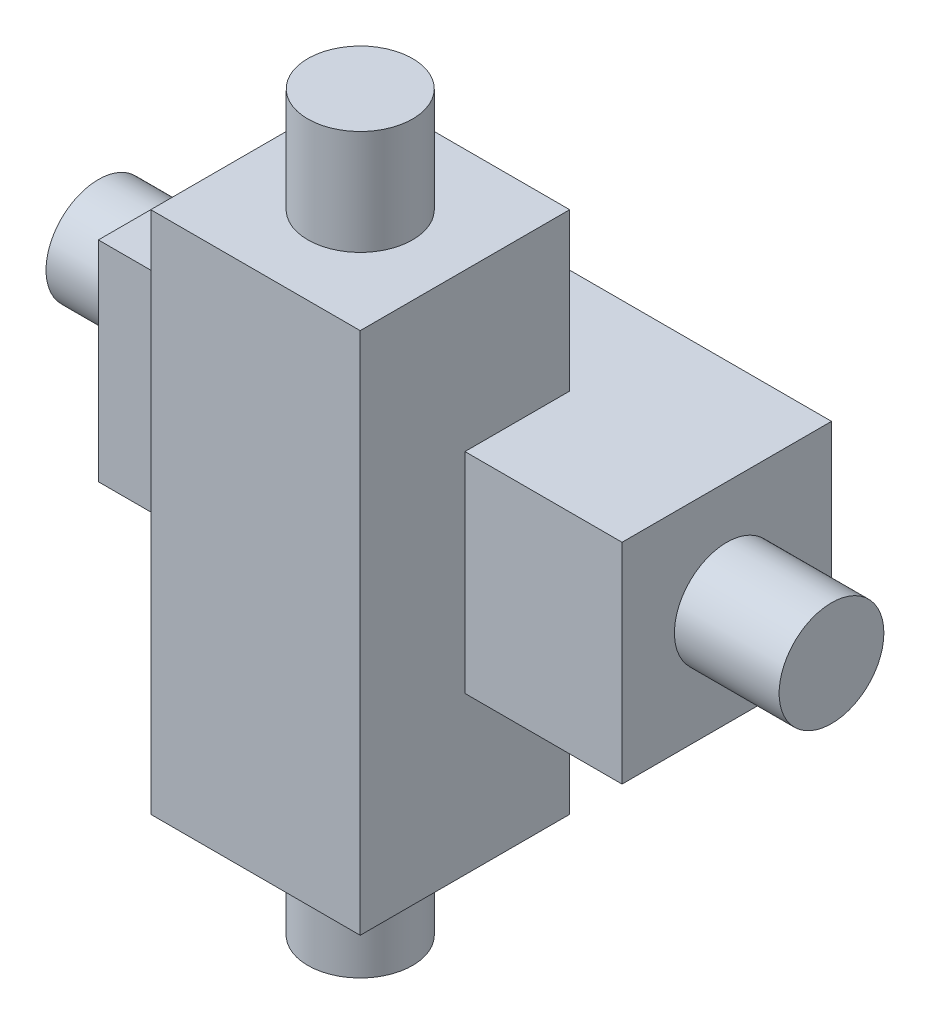
ISO-10303-21;
HEADER;
FILE_DESCRIPTION(('STEP AP214'),'2;1');
FILE_NAME('part.step','',(''),(''),'','','');
FILE_SCHEMA(('AUTOMOTIVE_DESIGN { 1 0 10303 214 1 1 1 1 }'));
ENDSEC;
DATA;
#1=APPLICATION_CONTEXT('core data for automotive mechanical design processes');
#2=APPLICATION_PROTOCOL_DEFINITION('international standard','automotive_design',2000,#1);
#3=PRODUCT_CONTEXT('',#1,'mechanical');
#4=PRODUCT('Part','Part','',(#3));
#5=PRODUCT_RELATED_PRODUCT_CATEGORY('part','',(#4));
#6=PRODUCT_DEFINITION_FORMATION('','',#4);
#7=PRODUCT_DEFINITION_CONTEXT('part definition',#1,'design');
#8=PRODUCT_DEFINITION('design','',#6,#7);
#9=PRODUCT_DEFINITION_SHAPE('','',#8);
#10=(LENGTH_UNIT() NAMED_UNIT(*) SI_UNIT(.MILLI.,.METRE.));
#11=(NAMED_UNIT(*) PLANE_ANGLE_UNIT() SI_UNIT($,.RADIAN.));
#12=(NAMED_UNIT(*) SI_UNIT($,.STERADIAN.) SOLID_ANGLE_UNIT());
#13=UNCERTAINTY_MEASURE_WITH_UNIT(LENGTH_MEASURE(1.E-05),#10,'distance_accuracy_value','');
#14=(GEOMETRIC_REPRESENTATION_CONTEXT(3) GLOBAL_UNCERTAINTY_ASSIGNED_CONTEXT((#13)) GLOBAL_UNIT_ASSIGNED_CONTEXT((#10,
#11,#12)) REPRESENTATION_CONTEXT('',''));
#15=CARTESIAN_POINT('',(0.,0.,0.));
#16=DIRECTION('',(0.,0.,1.));
#17=DIRECTION('',(1.,0.,0.));
#18=AXIS2_PLACEMENT_3D('',#15,#16,#17);
#19=CARTESIAN_POINT('',(1.,2.5,-0.999999999999996));
#20=DIRECTION('',(-1.,0.,0.));
#21=DIRECTION('',(0.,0.,1.));
#22=AXIS2_PLACEMENT_3D('',#19,#20,#21);
#23=PLANE('',#22);
#24=DIRECTION('',(0.,0.,1.));
#25=VECTOR('',#24,1.);
#26=CARTESIAN_POINT('',(1.,0.999999999999999,-0.999999999999996));
#27=LINE('',#26,#25);
#28=CARTESIAN_POINT('',(1.,0.999999999999999,-0.999999999999996));
#29=VERTEX_POINT('',#28);
#30=CARTESIAN_POINT('',(1.,0.999999999999999,0.));
#31=VERTEX_POINT('',#30);
#32=EDGE_CURVE('E174',#29,#31,#27,.T.);
#33=ORIENTED_EDGE('',*,*,#32,.F.);
#34=DIRECTION('',(0.,-1.,0.));
#35=VECTOR('',#34,1.);
#36=CARTESIAN_POINT('',(1.,2.5,-0.999999999999996));
#37=LINE('',#36,#35);
#38=CARTESIAN_POINT('',(1.,2.5,-0.999999999999996));
#39=VERTEX_POINT('',#38);
#40=EDGE_CURVE('E218',#39,#29,#37,.T.);
#41=ORIENTED_EDGE('',*,*,#40,.F.);
#42=DIRECTION('',(0.,0.,-1.));
#43=VECTOR('',#42,1.);
#44=CARTESIAN_POINT('',(1.,2.5,-0.999999999999996));
#45=LINE('',#44,#43);
#46=CARTESIAN_POINT('',(1.,2.5,1.));
#47=VERTEX_POINT('',#46);
#48=EDGE_CURVE('E178',#47,#39,#45,.T.);
#49=ORIENTED_EDGE('',*,*,#48,.F.);
#50=DIRECTION('',(0.,-1.,0.));
#51=VECTOR('',#50,1.);
#52=CARTESIAN_POINT('',(1.,2.5,1.));
#53=LINE('',#52,#51);
#54=CARTESIAN_POINT('',(1.,-2.5,1.));
#55=VERTEX_POINT('',#54);
#56=EDGE_CURVE('E192',#47,#55,#53,.T.);
#57=ORIENTED_EDGE('',*,*,#56,.T.);
#58=DIRECTION('',(0.,0.,-1.));
#59=VECTOR('',#58,1.);
#60=CARTESIAN_POINT('',(1.,-2.5,-0.999999999999996));
#61=LINE('',#60,#59);
#62=CARTESIAN_POINT('',(1.,-2.5,-0.999999999999996));
#63=VERTEX_POINT('',#62);
#64=EDGE_CURVE('E177',#55,#63,#61,.T.);
#65=ORIENTED_EDGE('',*,*,#64,.T.);
#66=CARTESIAN_POINT('',(1.,-0.999999999999999,-0.999999999999996));
#67=VERTEX_POINT('',#66);
#68=EDGE_CURVE('E217',#67,#63,#37,.T.);
#69=ORIENTED_EDGE('',*,*,#68,.F.);
#70=DIRECTION('',(0.,0.,-1.));
#71=VECTOR('',#70,1.);
#72=CARTESIAN_POINT('',(1.,-0.999999999999999,-0.999999999999996));
#73=LINE('',#72,#71);
#74=CARTESIAN_POINT('',(1.,-0.999999999999999,0.));
#75=VERTEX_POINT('',#74);
#76=EDGE_CURVE('E59',#75,#67,#73,.T.);
#77=ORIENTED_EDGE('',*,*,#76,.F.);
#78=DIRECTION('',(0.,-1.,0.));
#79=VECTOR('',#78,1.);
#80=CARTESIAN_POINT('',(1.,2.5,0.));
#81=LINE('',#80,#79);
#82=EDGE_CURVE('E54',#31,#75,#81,.T.);
#83=ORIENTED_EDGE('',*,*,#82,.F.);
#84=EDGE_LOOP('',(#33,#41,#49,#57,#65,#69,#77,#83));
#85=FACE_BOUND('',#84,.T.);
#86=ADVANCED_FACE('F39',(#85),#23,.F.);
#87=CARTESIAN_POINT('',(-0.999999999999996,2.5,-0.999999999999996));
#88=DIRECTION('',(0.,0.,1.));
#89=DIRECTION('',(1.,0.,0.));
#90=AXIS2_PLACEMENT_3D('',#87,#88,#89);
#91=PLANE('',#90);
#92=DIRECTION('',(1.,0.,0.));
#93=VECTOR('',#92,1.);
#94=CARTESIAN_POINT('',(-0.999999999999996,0.999999999999999,-0.999999999999996));
#95=LINE('',#94,#93);
#96=CARTESIAN_POINT('',(-0.999999999999996,0.999999999999999,-0.999999999999996));
#97=VERTEX_POINT('',#96);
#98=EDGE_CURVE('E171',#97,#29,#95,.T.);
#99=ORIENTED_EDGE('',*,*,#98,.F.);
#100=DIRECTION('',(0.,-1.,0.));
#101=VECTOR('',#100,1.);
#102=CARTESIAN_POINT('',(-0.999999999999996,2.5,-0.999999999999996));
#103=LINE('',#102,#101);
#104=CARTESIAN_POINT('',(-0.999999999999996,2.5,-0.999999999999996));
#105=VERTEX_POINT('',#104);
#106=EDGE_CURVE('E213',#105,#97,#103,.T.);
#107=ORIENTED_EDGE('',*,*,#106,.F.);
#108=DIRECTION('',(-1.,0.,0.));
#109=VECTOR('',#108,1.);
#110=CARTESIAN_POINT('',(-0.999999999999996,2.5,-0.999999999999996));
#111=LINE('',#110,#109);
#112=EDGE_CURVE('E182',#39,#105,#111,.T.);
#113=ORIENTED_EDGE('',*,*,#112,.F.);
#114=ORIENTED_EDGE('',*,*,#40,.T.);
#115=EDGE_LOOP('',(#99,#107,#113,#114));
#116=FACE_BOUND('',#115,.T.);
#117=ADVANCED_FACE('F336',(#116),#91,.F.);
#118=DIRECTION('',(-1.,0.,0.));
#119=VECTOR('',#118,1.);
#120=CARTESIAN_POINT('',(-0.999999999999996,-0.999999999999999,-0.999999999999996));
#121=LINE('',#120,#119);
#122=CARTESIAN_POINT('',(-0.999999999999996,-0.999999999999999,-0.999999999999996));
#123=VERTEX_POINT('',#122);
#124=EDGE_CURVE('E157',#67,#123,#121,.T.);
#125=ORIENTED_EDGE('',*,*,#124,.F.);
#126=ORIENTED_EDGE('',*,*,#68,.T.);
#127=DIRECTION('',(-1.,0.,0.));
#128=VECTOR('',#127,1.);
#129=CARTESIAN_POINT('',(-0.999999999999996,-2.5,-0.999999999999996));
#130=LINE('',#129,#128);
#131=CARTESIAN_POINT('',(-0.999999999999996,-2.5,-0.999999999999996));
#132=VERTEX_POINT('',#131);
#133=EDGE_CURVE('E196',#63,#132,#130,.T.);
#134=ORIENTED_EDGE('',*,*,#133,.T.);
#135=EDGE_CURVE('E212',#123,#132,#103,.T.);
#136=ORIENTED_EDGE('',*,*,#135,.F.);
#137=EDGE_LOOP('',(#125,#126,#134,#136));
#138=FACE_BOUND('',#137,.T.);
#139=ADVANCED_FACE('F261',(#138),#91,.F.);
#140=CARTESIAN_POINT('',(-0.999999999999996,2.5,-0.999999999999996));
#141=DIRECTION('',(1.,0.,0.));
#142=DIRECTION('',(0.,0.,-1.));
#143=AXIS2_PLACEMENT_3D('',#140,#141,#142);
#144=PLANE('',#143);
#145=DIRECTION('',(0.,0.,-1.));
#146=VECTOR('',#145,1.);
#147=CARTESIAN_POINT('',(-0.999999999999996,0.999999999999999,-0.999999999999996));
#148=LINE('',#147,#146);
#149=CARTESIAN_POINT('',(-0.999999999999996,0.999999999999999,0.));
#150=VERTEX_POINT('',#149);
#151=EDGE_CURVE('E230',#150,#97,#148,.T.);
#152=ORIENTED_EDGE('',*,*,#151,.F.);
#153=DIRECTION('',(0.,1.,0.));
#154=VECTOR('',#153,1.);
#155=CARTESIAN_POINT('',(-0.999999999999996,2.5,0.));
#156=LINE('',#155,#154);
#157=CARTESIAN_POINT('',(-0.999999999999996,-0.999999999999999,0.));
#158=VERTEX_POINT('',#157);
#159=EDGE_CURVE('E226',#158,#150,#156,.T.);
#160=ORIENTED_EDGE('',*,*,#159,.F.);
#161=DIRECTION('',(0.,0.,1.));
#162=VECTOR('',#161,1.);
#163=CARTESIAN_POINT('',(-0.999999999999996,-0.999999999999999,-0.999999999999996));
#164=LINE('',#163,#162);
#165=EDGE_CURVE('E222',#123,#158,#164,.T.);
#166=ORIENTED_EDGE('',*,*,#165,.F.);
#167=ORIENTED_EDGE('',*,*,#135,.T.);
#168=DIRECTION('',(0.,0.,1.));
#169=VECTOR('',#168,1.);
#170=CARTESIAN_POINT('',(-0.999999999999996,-2.5,-0.999999999999996));
#171=LINE('',#170,#169);
#172=CARTESIAN_POINT('',(-0.999999999999995,-2.5,1.));
#173=VERTEX_POINT('',#172);
#174=EDGE_CURVE('E200',#132,#173,#171,.T.);
#175=ORIENTED_EDGE('',*,*,#174,.T.);
#176=DIRECTION('',(0.,-1.,0.));
#177=VECTOR('',#176,1.);
#178=CARTESIAN_POINT('',(-0.999999999999995,2.5,1.));
#179=LINE('',#178,#177);
#180=CARTESIAN_POINT('',(-0.999999999999995,2.5,1.));
#181=VERTEX_POINT('',#180);
#182=EDGE_CURVE('E208',#181,#173,#179,.T.);
#183=ORIENTED_EDGE('',*,*,#182,.F.);
#184=DIRECTION('',(0.,0.,1.));
#185=VECTOR('',#184,1.);
#186=CARTESIAN_POINT('',(-0.999999999999996,2.5,-0.999999999999996));
#187=LINE('',#186,#185);
#188=EDGE_CURVE('E186',#105,#181,#187,.T.);
#189=ORIENTED_EDGE('',*,*,#188,.F.);
#190=ORIENTED_EDGE('',*,*,#106,.T.);
#191=EDGE_LOOP('',(#152,#160,#166,#167,#175,#183,#189,#190));
#192=FACE_BOUND('',#191,.T.);
#193=ADVANCED_FACE('F257',(#192),#144,.F.);
#194=CARTESIAN_POINT('',(-0.999999999999995,2.5,1.));
#195=DIRECTION('',(0.,0.,-1.));
#196=DIRECTION('',(-1.,0.,0.));
#197=AXIS2_PLACEMENT_3D('',#194,#195,#196);
#198=PLANE('',#197);
#199=DIRECTION('',(1.,0.,0.));
#200=VECTOR('',#199,1.);
#201=CARTESIAN_POINT('',(-0.999999999999995,-2.5,1.));
#202=LINE('',#201,#200);
#203=EDGE_CURVE('E183',#173,#55,#202,.T.);
#204=ORIENTED_EDGE('',*,*,#203,.T.);
#205=ORIENTED_EDGE('',*,*,#56,.F.);
#206=DIRECTION('',(1.,0.,0.));
#207=VECTOR('',#206,1.);
#208=CARTESIAN_POINT('',(-0.999999999999995,2.5,1.));
#209=LINE('',#208,#207);
#210=EDGE_CURVE('E189',#181,#47,#209,.T.);
#211=ORIENTED_EDGE('',*,*,#210,.F.);
#212=ORIENTED_EDGE('',*,*,#182,.T.);
#213=EDGE_LOOP('',(#204,#205,#211,#212));
#214=FACE_BOUND('',#213,.T.);
#215=ADVANCED_FACE('F253',(#214),#198,.F.);
#216=CARTESIAN_POINT('',(0.,2.5,0.));
#217=DIRECTION('',(0.,1.,0.));
#218=DIRECTION('',(0.,0.,1.));
#219=AXIS2_PLACEMENT_3D('',#216,#217,#218);
#220=PLANE('',#219);
#221=CARTESIAN_POINT('',(0.,2.5,0.));
#222=DIRECTION('',(0.,1.,0.));
#223=DIRECTION('',(0.,0.,1.));
#224=AXIS2_PLACEMENT_3D('',#221,#222,#223);
#225=CIRCLE('',#224,0.5);
#226=CARTESIAN_POINT('',(0.,2.5,0.5));
#227=VERTEX_POINT('',#226);
#228=EDGE_CURVE('E289',#227,#227,#225,.F.);
#229=ORIENTED_EDGE('',*,*,#228,.T.);
#230=EDGE_LOOP('',(#229));
#231=FACE_BOUND('',#230,.T.);
#232=ORIENTED_EDGE('',*,*,#48,.T.);
#233=ORIENTED_EDGE('',*,*,#112,.T.);
#234=ORIENTED_EDGE('',*,*,#188,.T.);
#235=ORIENTED_EDGE('',*,*,#210,.T.);
#236=EDGE_LOOP('',(#232,#233,#234,#235));
#237=FACE_BOUND('',#236,.T.);
#238=ADVANCED_FACE('F242',(#231,#237),#220,.T.);
#239=CARTESIAN_POINT('',(0.,-2.5,0.));
#240=DIRECTION('',(0.,1.,0.));
#241=DIRECTION('',(0.,0.,1.));
#242=AXIS2_PLACEMENT_3D('',#239,#240,#241);
#243=PLANE('',#242);
#244=CARTESIAN_POINT('',(0.,-2.5,0.));
#245=DIRECTION('',(0.,1.,0.));
#246=DIRECTION('',(0.,0.,1.));
#247=AXIS2_PLACEMENT_3D('',#244,#245,#246);
#248=CIRCLE('',#247,0.5);
#249=CARTESIAN_POINT('',(0.,-2.5,0.5));
#250=VERTEX_POINT('',#249);
#251=EDGE_CURVE('E47',#250,#250,#248,.F.);
#252=ORIENTED_EDGE('',*,*,#251,.F.);
#253=EDGE_LOOP('',(#252));
#254=FACE_BOUND('',#253,.T.);
#255=ORIENTED_EDGE('',*,*,#64,.F.);
#256=ORIENTED_EDGE('',*,*,#203,.F.);
#257=ORIENTED_EDGE('',*,*,#174,.F.);
#258=ORIENTED_EDGE('',*,*,#133,.F.);
#259=EDGE_LOOP('',(#255,#256,#257,#258));
#260=FACE_BOUND('',#259,.T.);
#261=ADVANCED_FACE('F239',(#254,#260),#243,.F.);
#262=CARTESIAN_POINT('',(2.5,0.999999999999999,0.));
#263=DIRECTION('',(0.,-1.,0.));
#264=DIRECTION('',(0.,0.,-1.));
#265=AXIS2_PLACEMENT_3D('',#262,#263,#264);
#266=PLANE('',#265);
#267=ORIENTED_EDGE('',*,*,#98,.T.);
#268=ORIENTED_EDGE('',*,*,#32,.T.);
#269=DIRECTION('',(-1.,0.,0.));
#270=VECTOR('',#269,1.);
#271=CARTESIAN_POINT('',(2.5,0.999999999999999,0.));
#272=LINE('',#271,#270);
#273=CARTESIAN_POINT('',(2.5,0.999999999999999,0.));
#274=VERTEX_POINT('',#273);
#275=EDGE_CURVE('E136',#274,#31,#272,.T.);
#276=ORIENTED_EDGE('',*,*,#275,.F.);
#277=DIRECTION('',(0.,0.,1.));
#278=VECTOR('',#277,1.);
#279=CARTESIAN_POINT('',(2.5,0.999999999999999,0.));
#280=LINE('',#279,#278);
#281=CARTESIAN_POINT('',(2.5,0.999999999999999,-2.));
#282=VERTEX_POINT('',#281);
#283=EDGE_CURVE('E127',#282,#274,#280,.T.);
#284=ORIENTED_EDGE('',*,*,#283,.F.);
#285=DIRECTION('',(-1.,0.,0.));
#286=VECTOR('',#285,1.);
#287=CARTESIAN_POINT('',(2.5,0.999999999999999,-2.));
#288=LINE('',#287,#286);
#289=CARTESIAN_POINT('',(-2.5,0.999999999999999,-2.));
#290=VERTEX_POINT('',#289);
#291=EDGE_CURVE('E133',#282,#290,#288,.T.);
#292=ORIENTED_EDGE('',*,*,#291,.T.);
#293=DIRECTION('',(0.,0.,1.));
#294=VECTOR('',#293,1.);
#295=CARTESIAN_POINT('',(-2.5,0.999999999999999,0.));
#296=LINE('',#295,#294);
#297=CARTESIAN_POINT('',(-2.5,0.999999999999999,0.));
#298=VERTEX_POINT('',#297);
#299=EDGE_CURVE('E284',#290,#298,#296,.T.);
#300=ORIENTED_EDGE('',*,*,#299,.T.);
#301=EDGE_CURVE('E163',#150,#298,#272,.T.);
#302=ORIENTED_EDGE('',*,*,#301,.F.);
#303=ORIENTED_EDGE('',*,*,#151,.T.);
#304=EDGE_LOOP('',(#267,#268,#276,#284,#292,#300,#302,#303));
#305=FACE_BOUND('',#304,.T.);
#306=ADVANCED_FACE('F130',(#305),#266,.F.);
#307=CARTESIAN_POINT('',(2.5,0.999999999999999,0.));
#308=DIRECTION('',(0.,0.,-1.));
#309=DIRECTION('',(0.,1.,0.));
#310=AXIS2_PLACEMENT_3D('',#307,#308,#309);
#311=PLANE('',#310);
#312=ORIENTED_EDGE('',*,*,#275,.T.);
#313=ORIENTED_EDGE('',*,*,#82,.T.);
#314=DIRECTION('',(-1.,0.,0.));
#315=VECTOR('',#314,1.);
#316=CARTESIAN_POINT('',(2.5,-0.999999999999999,0.));
#317=LINE('',#316,#315);
#318=CARTESIAN_POINT('',(2.5,-0.999999999999999,0.));
#319=VERTEX_POINT('',#318);
#320=EDGE_CURVE('E268',#319,#75,#317,.T.);
#321=ORIENTED_EDGE('',*,*,#320,.F.);
#322=DIRECTION('',(0.,-1.,0.));
#323=VECTOR('',#322,1.);
#324=CARTESIAN_POINT('',(2.5,0.999999999999999,0.));
#325=LINE('',#324,#323);
#326=EDGE_CURVE('E140',#274,#319,#325,.T.);
#327=ORIENTED_EDGE('',*,*,#326,.F.);
#328=EDGE_LOOP('',(#312,#313,#321,#327));
#329=FACE_BOUND('',#328,.T.);
#330=ADVANCED_FACE('F356',(#329),#311,.F.);
#331=CARTESIAN_POINT('',(-2.5,-0.999999999999999,0.));
#332=VERTEX_POINT('',#331);
#333=EDGE_CURVE('E271',#158,#332,#317,.T.);
#334=ORIENTED_EDGE('',*,*,#333,.F.);
#335=ORIENTED_EDGE('',*,*,#159,.T.);
#336=ORIENTED_EDGE('',*,*,#301,.T.);
#337=DIRECTION('',(0.,-1.,0.));
#338=VECTOR('',#337,1.);
#339=CARTESIAN_POINT('',(-2.5,0.999999999999999,0.));
#340=LINE('',#339,#338);
#341=EDGE_CURVE('E280',#298,#332,#340,.T.);
#342=ORIENTED_EDGE('',*,*,#341,.T.);
#343=EDGE_LOOP('',(#334,#335,#336,#342));
#344=FACE_BOUND('',#343,.T.);
#345=ADVANCED_FACE('F359',(#344),#311,.F.);
#346=CARTESIAN_POINT('',(2.5,-0.999999999999999,0.));
#347=DIRECTION('',(0.,1.,0.));
#348=DIRECTION('',(0.,0.,1.));
#349=AXIS2_PLACEMENT_3D('',#346,#347,#348);
#350=PLANE('',#349);
#351=ORIENTED_EDGE('',*,*,#320,.T.);
#352=ORIENTED_EDGE('',*,*,#76,.T.);
#353=ORIENTED_EDGE('',*,*,#124,.T.);
#354=ORIENTED_EDGE('',*,*,#165,.T.);
#355=ORIENTED_EDGE('',*,*,#333,.T.);
#356=DIRECTION('',(0.,0.,-1.));
#357=VECTOR('',#356,1.);
#358=CARTESIAN_POINT('',(-2.5,-0.999999999999999,0.));
#359=LINE('',#358,#357);
#360=CARTESIAN_POINT('',(-2.5,-0.999999999999999,-2.));
#361=VERTEX_POINT('',#360);
#362=EDGE_CURVE('E151',#332,#361,#359,.T.);
#363=ORIENTED_EDGE('',*,*,#362,.T.);
#364=DIRECTION('',(-1.,0.,0.));
#365=VECTOR('',#364,1.);
#366=CARTESIAN_POINT('',(2.5,-0.999999999999999,-2.));
#367=LINE('',#366,#365);
#368=CARTESIAN_POINT('',(2.5,-0.999999999999999,-2.));
#369=VERTEX_POINT('',#368);
#370=EDGE_CURVE('E274',#369,#361,#367,.T.);
#371=ORIENTED_EDGE('',*,*,#370,.F.);
#372=DIRECTION('',(0.,0.,-1.));
#373=VECTOR('',#372,1.);
#374=CARTESIAN_POINT('',(2.5,-0.999999999999999,0.));
#375=LINE('',#374,#373);
#376=EDGE_CURVE('E146',#319,#369,#375,.T.);
#377=ORIENTED_EDGE('',*,*,#376,.F.);
#378=EDGE_LOOP('',(#351,#352,#353,#354,#355,#363,#371,#377));
#379=FACE_BOUND('',#378,.T.);
#380=ADVANCED_FACE('F265',(#379),#350,.F.);
#381=CARTESIAN_POINT('',(2.5,0.999999999999999,-2.));
#382=DIRECTION('',(0.,0.,1.));
#383=DIRECTION('',(0.,-1.,0.));
#384=AXIS2_PLACEMENT_3D('',#381,#382,#383);
#385=PLANE('',#384);
#386=DIRECTION('',(0.,1.,0.));
#387=VECTOR('',#386,1.);
#388=CARTESIAN_POINT('',(-2.5,0.999999999999999,-2.));
#389=LINE('',#388,#387);
#390=EDGE_CURVE('E155',#361,#290,#389,.T.);
#391=ORIENTED_EDGE('',*,*,#390,.T.);
#392=ORIENTED_EDGE('',*,*,#291,.F.);
#393=DIRECTION('',(0.,1.,0.));
#394=VECTOR('',#393,1.);
#395=CARTESIAN_POINT('',(2.5,0.999999999999999,-2.));
#396=LINE('',#395,#394);
#397=EDGE_CURVE('E141',#369,#282,#396,.T.);
#398=ORIENTED_EDGE('',*,*,#397,.F.);
#399=ORIENTED_EDGE('',*,*,#370,.T.);
#400=EDGE_LOOP('',(#391,#392,#398,#399));
#401=FACE_BOUND('',#400,.T.);
#402=ADVANCED_FACE('F153',(#401),#385,.F.);
#403=CARTESIAN_POINT('',(2.5,0.,0.));
#404=DIRECTION('',(1.,0.,0.));
#405=DIRECTION('',(0.,0.,-1.));
#406=AXIS2_PLACEMENT_3D('',#403,#404,#405);
#407=PLANE('',#406);
#408=CARTESIAN_POINT('',(2.5,0.,-0.999999999999992));
#409=DIRECTION('',(1.,0.,0.));
#410=DIRECTION('',(0.,0.,-1.));
#411=AXIS2_PLACEMENT_3D('',#408,#409,#410);
#412=CIRCLE('',#411,0.5);
#413=CARTESIAN_POINT('',(2.5,0.,-1.49999999999999));
#414=VERTEX_POINT('',#413);
#415=EDGE_CURVE('E302',#414,#414,#412,.F.);
#416=ORIENTED_EDGE('',*,*,#415,.T.);
#417=EDGE_LOOP('',(#416));
#418=FACE_BOUND('',#417,.T.);
#419=ORIENTED_EDGE('',*,*,#397,.T.);
#420=ORIENTED_EDGE('',*,*,#283,.T.);
#421=ORIENTED_EDGE('',*,*,#326,.T.);
#422=ORIENTED_EDGE('',*,*,#376,.T.);
#423=EDGE_LOOP('',(#419,#420,#421,#422));
#424=FACE_BOUND('',#423,.T.);
#425=ADVANCED_FACE('F144',(#418,#424),#407,.T.);
#426=CARTESIAN_POINT('',(-2.5,0.,0.));
#427=DIRECTION('',(1.,0.,0.));
#428=DIRECTION('',(0.,0.,-1.));
#429=AXIS2_PLACEMENT_3D('',#426,#427,#428);
#430=PLANE('',#429);
#431=CARTESIAN_POINT('',(-2.5,0.,-0.999999999999992));
#432=DIRECTION('',(1.,0.,0.));
#433=DIRECTION('',(0.,0.,-1.));
#434=AXIS2_PLACEMENT_3D('',#431,#432,#433);
#435=CIRCLE('',#434,0.5);
#436=CARTESIAN_POINT('',(-2.5,0.,-1.49999999999999));
#437=VERTEX_POINT('',#436);
#438=EDGE_CURVE('E11',#437,#437,#435,.F.);
#439=ORIENTED_EDGE('',*,*,#438,.F.);
#440=EDGE_LOOP('',(#439));
#441=FACE_BOUND('',#440,.T.);
#442=ORIENTED_EDGE('',*,*,#390,.F.);
#443=ORIENTED_EDGE('',*,*,#362,.F.);
#444=ORIENTED_EDGE('',*,*,#341,.F.);
#445=ORIENTED_EDGE('',*,*,#299,.F.);
#446=EDGE_LOOP('',(#442,#443,#444,#445));
#447=FACE_BOUND('',#446,.T.);
#448=ADVANCED_FACE('F362',(#441,#447),#430,.F.);
#449=CARTESIAN_POINT('',(0.,-3.5,0.));
#450=DIRECTION('',(0.,1.,0.));
#451=DIRECTION('',(0.,0.,1.));
#452=AXIS2_PLACEMENT_3D('',#449,#450,#451);
#453=PLANE('',#452);
#454=CARTESIAN_POINT('',(0.,-3.5,0.));
#455=DIRECTION('',(0.,1.,0.));
#456=DIRECTION('',(0.,0.,1.));
#457=AXIS2_PLACEMENT_3D('',#454,#455,#456);
#458=CIRCLE('',#457,0.5);
#459=CARTESIAN_POINT('',(0.,-3.5,0.5));
#460=VERTEX_POINT('',#459);
#461=EDGE_CURVE('E298',#460,#460,#458,.T.);
#462=ORIENTED_EDGE('',*,*,#461,.F.);
#463=EDGE_LOOP('',(#462));
#464=FACE_BOUND('',#463,.T.);
#465=ADVANCED_FACE('F365',(#464),#453,.F.);
#466=CARTESIAN_POINT('',(0.,3.5,0.));
#467=DIRECTION('',(0.,-1.,0.));
#468=DIRECTION('',(0.,0.,-1.));
#469=AXIS2_PLACEMENT_3D('',#466,#467,#468);
#470=CYLINDRICAL_SURFACE('',#469,0.5);
#471=ORIENTED_EDGE('',*,*,#461,.T.);
#472=EDGE_LOOP('',(#471));
#473=FACE_BOUND('',#472,.T.);
#474=ORIENTED_EDGE('',*,*,#251,.T.);
#475=EDGE_LOOP('',(#474));
#476=FACE_BOUND('',#475,.T.);
#477=ADVANCED_FACE('F237',(#473,#476),#470,.T.);
#478=ORIENTED_EDGE('',*,*,#228,.F.);
#479=EDGE_LOOP('',(#478));
#480=FACE_BOUND('',#479,.T.);
#481=CARTESIAN_POINT('',(0.,3.5,0.));
#482=DIRECTION('',(0.,1.,0.));
#483=DIRECTION('',(0.,0.,1.));
#484=AXIS2_PLACEMENT_3D('',#481,#482,#483);
#485=CIRCLE('',#484,0.5);
#486=CARTESIAN_POINT('',(0.,3.5,0.5));
#487=VERTEX_POINT('',#486);
#488=EDGE_CURVE('E297',#487,#487,#485,.T.);
#489=ORIENTED_EDGE('',*,*,#488,.F.);
#490=EDGE_LOOP('',(#489));
#491=FACE_BOUND('',#490,.T.);
#492=ADVANCED_FACE('F370',(#480,#491),#470,.T.);
#493=CARTESIAN_POINT('',(0.,3.5,0.));
#494=DIRECTION('',(0.,1.,0.));
#495=DIRECTION('',(0.,0.,1.));
#496=AXIS2_PLACEMENT_3D('',#493,#494,#495);
#497=PLANE('',#496);
#498=ORIENTED_EDGE('',*,*,#488,.T.);
#499=EDGE_LOOP('',(#498));
#500=FACE_BOUND('',#499,.T.);
#501=ADVANCED_FACE('F373',(#500),#497,.T.);
#502=CARTESIAN_POINT('',(-3.5,0.,-0.999999999999992));
#503=DIRECTION('',(1.,0.,0.));
#504=DIRECTION('',(0.,0.,-1.));
#505=AXIS2_PLACEMENT_3D('',#502,#503,#504);
#506=PLANE('',#505);
#507=CARTESIAN_POINT('',(-3.5,0.,-0.999999999999992));
#508=DIRECTION('',(1.,0.,0.));
#509=DIRECTION('',(0.,0.,-1.));
#510=AXIS2_PLACEMENT_3D('',#507,#508,#509);
#511=CIRCLE('',#510,0.5);
#512=CARTESIAN_POINT('',(-3.5,0.,-1.49999999999999));
#513=VERTEX_POINT('',#512);
#514=EDGE_CURVE('E310',#513,#513,#511,.T.);
#515=ORIENTED_EDGE('',*,*,#514,.F.);
#516=EDGE_LOOP('',(#515));
#517=FACE_BOUND('',#516,.T.);
#518=ADVANCED_FACE('F330',(#517),#506,.F.);
#519=CARTESIAN_POINT('',(3.5,0.,-0.999999999999992));
#520=DIRECTION('',(-1.,0.,0.));
#521=DIRECTION('',(0.,0.,1.));
#522=AXIS2_PLACEMENT_3D('',#519,#520,#521);
#523=CYLINDRICAL_SURFACE('',#522,0.5);
#524=ORIENTED_EDGE('',*,*,#514,.T.);
#525=EDGE_LOOP('',(#524));
#526=FACE_BOUND('',#525,.T.);
#527=ORIENTED_EDGE('',*,*,#438,.T.);
#528=EDGE_LOOP('',(#527));
#529=FACE_BOUND('',#528,.T.);
#530=ADVANCED_FACE('F322',(#526,#529),#523,.T.);
#531=ORIENTED_EDGE('',*,*,#415,.F.);
#532=EDGE_LOOP('',(#531));
#533=FACE_BOUND('',#532,.T.);
#534=CARTESIAN_POINT('',(3.5,0.,-0.999999999999992));
#535=DIRECTION('',(1.,0.,0.));
#536=DIRECTION('',(0.,0.,-1.));
#537=AXIS2_PLACEMENT_3D('',#534,#535,#536);
#538=CIRCLE('',#537,0.5);
#539=CARTESIAN_POINT('',(3.5,0.,-1.49999999999999));
#540=VERTEX_POINT('',#539);
#541=EDGE_CURVE('E309',#540,#540,#538,.T.);
#542=ORIENTED_EDGE('',*,*,#541,.F.);
#543=EDGE_LOOP('',(#542));
#544=FACE_BOUND('',#543,.T.);
#545=ADVANCED_FACE('F320',(#533,#544),#523,.T.);
#546=CARTESIAN_POINT('',(3.5,0.,-0.999999999999992));
#547=DIRECTION('',(1.,0.,0.));
#548=DIRECTION('',(0.,0.,-1.));
#549=AXIS2_PLACEMENT_3D('',#546,#547,#548);
#550=PLANE('',#549);
#551=ORIENTED_EDGE('',*,*,#541,.T.);
#552=EDGE_LOOP('',(#551));
#553=FACE_BOUND('',#552,.T.);
#554=ADVANCED_FACE('F318',(#553),#550,.T.);
#555=CLOSED_SHELL('',(#86,#117,#139,#193,#215,#238,#261,#306,#330,#345,#380,#402,#425,#448,#465,
#477,#492,#501,#518,#530,#545,#554));
#556=MANIFOLD_SOLID_BREP('B2',#555);
#557=ADVANCED_BREP_SHAPE_REPRESENTATION('',(#18,#556),#14);
#558=SHAPE_DEFINITION_REPRESENTATION(#9,#557);
ENDSEC;
END-ISO-10303-21;
